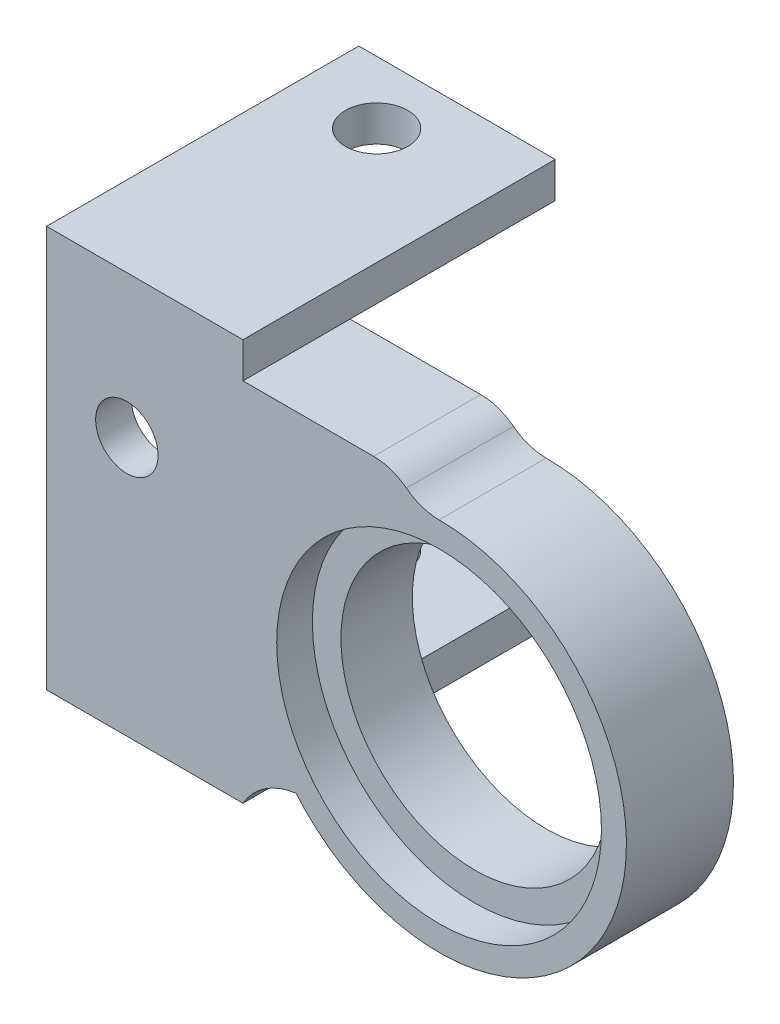
ISO-10303-21;
HEADER;
FILE_DESCRIPTION(('STEP AP214'),'2;1');
FILE_NAME('part.step','',(''),(''),'','','');
FILE_SCHEMA(('AUTOMOTIVE_DESIGN { 1 0 10303 214 1 1 1 1 }'));
ENDSEC;
DATA;
#1=APPLICATION_CONTEXT('core data for automotive mechanical design processes');
#2=APPLICATION_PROTOCOL_DEFINITION('international standard','automotive_design',2000,#1);
#3=PRODUCT_CONTEXT('',#1,'mechanical');
#4=PRODUCT('Part','Part','',(#3));
#5=PRODUCT_RELATED_PRODUCT_CATEGORY('part','',(#4));
#6=PRODUCT_DEFINITION_FORMATION('','',#4);
#7=PRODUCT_DEFINITION_CONTEXT('part definition',#1,'design');
#8=PRODUCT_DEFINITION('design','',#6,#7);
#9=PRODUCT_DEFINITION_SHAPE('','',#8);
#10=(LENGTH_UNIT() NAMED_UNIT(*) SI_UNIT(.MILLI.,.METRE.));
#11=(NAMED_UNIT(*) PLANE_ANGLE_UNIT() SI_UNIT($,.RADIAN.));
#12=(NAMED_UNIT(*) SI_UNIT($,.STERADIAN.) SOLID_ANGLE_UNIT());
#13=UNCERTAINTY_MEASURE_WITH_UNIT(LENGTH_MEASURE(1.E-05),#10,'distance_accuracy_value','');
#14=(GEOMETRIC_REPRESENTATION_CONTEXT(3) GLOBAL_UNCERTAINTY_ASSIGNED_CONTEXT((#13)) GLOBAL_UNIT_ASSIGNED_CONTEXT((#10,
#11,#12)) REPRESENTATION_CONTEXT('',''));
#15=CARTESIAN_POINT('',(0.,0.,0.));
#16=DIRECTION('',(0.,0.,1.));
#17=DIRECTION('',(1.,0.,0.));
#18=AXIS2_PLACEMENT_3D('',#15,#16,#17);
#19=CARTESIAN_POINT('',(0.,0.,-57.));
#20=DIRECTION('',(0.,0.,1.));
#21=DIRECTION('',(1.,0.,0.));
#22=AXIS2_PLACEMENT_3D('',#19,#20,#21);
#23=CYLINDRICAL_SURFACE('',#22,7.5);
#24=CARTESIAN_POINT('',(0.,0.,-57.));
#25=DIRECTION('',(0.,0.,1.));
#26=DIRECTION('',(1.,0.,0.));
#27=AXIS2_PLACEMENT_3D('',#24,#25,#26);
#28=CIRCLE('',#27,7.5);
#29=CARTESIAN_POINT('',(7.5,0.,-57.));
#30=VERTEX_POINT('',#29);
#31=EDGE_CURVE('E144',#30,#30,#28,.T.);
#32=CARTESIAN_POINT('',(0.,0.,-53.));
#33=DIRECTION('',(0.,0.,1.));
#34=DIRECTION('',(1.,0.,0.));
#35=AXIS2_PLACEMENT_3D('',#32,#33,#34);
#36=CIRCLE('',#35,7.5);
#37=CARTESIAN_POINT('',(7.5,0.,-53.));
#38=VERTEX_POINT('',#37);
#39=EDGE_CURVE('E38',#38,#38,#36,.F.);
#40=CARTESIAN_POINT('',(7.5,0.,-57.));
#41=CARTESIAN_POINT('',(7.5,0.,-56.9583333333333));
#42=CARTESIAN_POINT('',(7.5,0.,-56.9166666666667));
#43=CARTESIAN_POINT('',(7.5,0.,-56.8333333333333));
#44=CARTESIAN_POINT('',(7.5,0.,-56.7916666666667));
#45=CARTESIAN_POINT('',(7.5,0.,-56.7083333333333));
#46=CARTESIAN_POINT('',(7.5,0.,-56.6666666666667));
#47=CARTESIAN_POINT('',(7.5,0.,-56.5833333333333));
#48=CARTESIAN_POINT('',(7.5,0.,-56.5416666666667));
#49=CARTESIAN_POINT('',(7.5,0.,-56.4583333333333));
#50=CARTESIAN_POINT('',(7.5,0.,-56.4166666666667));
#51=CARTESIAN_POINT('',(7.5,0.,-56.3333333333333));
#52=CARTESIAN_POINT('',(7.5,0.,-56.2916666666667));
#53=CARTESIAN_POINT('',(7.5,0.,-56.2083333333333));
#54=CARTESIAN_POINT('',(7.5,0.,-56.1666666666667));
#55=CARTESIAN_POINT('',(7.5,0.,-56.0833333333333));
#56=CARTESIAN_POINT('',(7.5,0.,-56.0416666666667));
#57=CARTESIAN_POINT('',(7.5,0.,-55.9583333333333));
#58=CARTESIAN_POINT('',(7.5,0.,-55.9166666666667));
#59=CARTESIAN_POINT('',(7.5,0.,-55.8333333333333));
#60=CARTESIAN_POINT('',(7.5,0.,-55.7916666666667));
#61=CARTESIAN_POINT('',(7.5,0.,-55.7083333333333));
#62=CARTESIAN_POINT('',(7.5,0.,-55.6666666666667));
#63=CARTESIAN_POINT('',(7.5,0.,-55.5833333333333));
#64=CARTESIAN_POINT('',(7.5,0.,-55.5416666666667));
#65=CARTESIAN_POINT('',(7.5,0.,-55.4583333333333));
#66=CARTESIAN_POINT('',(7.5,0.,-55.4166666666667));
#67=CARTESIAN_POINT('',(7.5,0.,-55.3333333333333));
#68=CARTESIAN_POINT('',(7.5,0.,-55.2916666666667));
#69=CARTESIAN_POINT('',(7.5,0.,-55.2083333333333));
#70=CARTESIAN_POINT('',(7.5,0.,-55.1666666666667));
#71=CARTESIAN_POINT('',(7.5,0.,-55.0833333333333));
#72=CARTESIAN_POINT('',(7.5,0.,-55.0416666666667));
#73=CARTESIAN_POINT('',(7.5,0.,-54.9583333333333));
#74=CARTESIAN_POINT('',(7.5,0.,-54.9166666666667));
#75=CARTESIAN_POINT('',(7.5,0.,-54.8333333333333));
#76=CARTESIAN_POINT('',(7.5,0.,-54.7916666666667));
#77=CARTESIAN_POINT('',(7.5,0.,-54.7083333333333));
#78=CARTESIAN_POINT('',(7.5,0.,-54.6666666666667));
#79=CARTESIAN_POINT('',(7.5,0.,-54.5833333333333));
#80=CARTESIAN_POINT('',(7.5,0.,-54.5416666666667));
#81=CARTESIAN_POINT('',(7.5,0.,-54.4583333333333));
#82=CARTESIAN_POINT('',(7.5,0.,-54.4166666666667));
#83=CARTESIAN_POINT('',(7.5,0.,-54.3333333333333));
#84=CARTESIAN_POINT('',(7.5,0.,-54.2916666666667));
#85=CARTESIAN_POINT('',(7.5,0.,-54.2083333333333));
#86=CARTESIAN_POINT('',(7.5,0.,-54.1666666666667));
#87=CARTESIAN_POINT('',(7.5,0.,-54.0833333333333));
#88=CARTESIAN_POINT('',(7.5,0.,-54.0416666666667));
#89=CARTESIAN_POINT('',(7.5,0.,-53.9583333333333));
#90=CARTESIAN_POINT('',(7.5,0.,-53.9166666666667));
#91=CARTESIAN_POINT('',(7.5,0.,-53.8333333333333));
#92=CARTESIAN_POINT('',(7.5,0.,-53.7916666666667));
#93=CARTESIAN_POINT('',(7.5,0.,-53.7083333333333));
#94=CARTESIAN_POINT('',(7.5,0.,-53.6666666666667));
#95=CARTESIAN_POINT('',(7.5,0.,-53.5833333333333));
#96=CARTESIAN_POINT('',(7.5,0.,-53.5416666666667));
#97=CARTESIAN_POINT('',(7.5,0.,-53.4583333333333));
#98=CARTESIAN_POINT('',(7.5,0.,-53.4166666666667));
#99=CARTESIAN_POINT('',(7.5,0.,-53.3333333333333));
#100=CARTESIAN_POINT('',(7.5,0.,-53.2916666666667));
#101=CARTESIAN_POINT('',(7.5,0.,-53.2083333333333));
#102=CARTESIAN_POINT('',(7.5,0.,-53.1666666666667));
#103=CARTESIAN_POINT('',(7.5,0.,-53.0833333333333));
#104=CARTESIAN_POINT('',(7.5,0.,-53.0416666666667));
#105=CARTESIAN_POINT('',(7.5,0.,-53.));
#106=B_SPLINE_CURVE_WITH_KNOTS('',3,(#40,#41,#42,#43,#44,#45,#46,#47,#48,#49,#50,#51,#52,#53,
#54,#55,#56,#57,#58,#59,#60,#61,#62,#63,#64,#65,#66,#67,#68,#69,#70,#71,#72,#73,#74,#75,#76,#77,
#78,#79,#80,#81,#82,#83,#84,#85,#86,#87,#88,#89,#90,#91,#92,#93,#94,#95,#96,#97,#98,#99,#100,
#101,#102,#103,#104,#105),.UNSPECIFIED.,.F.,.F.,(4,2,2,2,2,2,2,2,2,2,2,2,2,2,2,2,2,2,2,2,2,2,2,
2,2,2,2,2,2,2,2,2,4),(0.,0.124999999999993,0.249999999999993,0.374999999999993,
0.499999999999994,0.624999999999994,0.749999999999994,0.874999999999994,0.999999999999994,
1.12499999999999,1.24999999999999,1.37499999999999,1.49999999999999,1.62499999999999,
1.74999999999999,1.87499999999999,1.99999999999999,2.125,2.25,2.375,2.5,2.625,2.75,2.875,3.,
3.125,3.25,3.375,3.5,3.625,3.75,3.87499999999999,3.99999999999999),.UNSPECIFIED.);
#107=EDGE_CURVE('BSEAM35',#30,#38,#106,.T.);
#108=ORIENTED_EDGE('',*,*,#31,.F.);
#109=ORIENTED_EDGE('',*,*,#39,.F.);
#110=ORIENTED_EDGE('',*,*,#107,.T.);
#111=ORIENTED_EDGE('',*,*,#107,.F.);
#112=EDGE_LOOP('',(#108,#110,#109,#111));
#113=FACE_BOUND('',#112,.T.);
#114=ADVANCED_FACE('F35',(#113),#23,.F.);
#115=CARTESIAN_POINT('',(-1.8328597873269,11.125,-51.));
#116=DIRECTION('',(0.,0.,1.));
#117=DIRECTION('',(1.,0.,0.));
#118=AXIS2_PLACEMENT_3D('',#115,#116,#117);
#119=PLANE('',#118);
#120=CARTESIAN_POINT('',(0.,0.,-51.));
#121=DIRECTION('',(0.,0.,1.));
#122=DIRECTION('',(1.,0.,0.));
#123=AXIS2_PLACEMENT_3D('',#120,#121,#122);
#124=CIRCLE('',#123,9.1);
#125=CARTESIAN_POINT('',(9.1,0.,-51.));
#126=VERTEX_POINT('',#125);
#127=EDGE_CURVE('E127',#126,#126,#124,.T.);
#128=ORIENTED_EDGE('',*,*,#127,.F.);
#129=EDGE_LOOP('',(#128));
#130=FACE_BOUND('',#129,.T.);
#131=CARTESIAN_POINT('',(0.,0.,-51.));
#132=DIRECTION('',(0.,0.,1.));
#133=DIRECTION('',(1.,0.,0.));
#134=AXIS2_PLACEMENT_3D('',#131,#132,#133);
#135=CIRCLE('',#134,10.5);
#136=CARTESIAN_POINT('',(0.,10.5,-51.));
#137=VERTEX_POINT('',#136);
#138=CARTESIAN_POINT('',(-8.01732503696485,-6.78030229795591,-51.));
#139=VERTEX_POINT('',#138);
#140=EDGE_CURVE('E111',#137,#139,#135,.F.);
#141=ORIENTED_EDGE('',*,*,#140,.F.);
#142=CARTESIAN_POINT('',(0.,13.5,-51.));
#143=DIRECTION('',(0.,0.,1.));
#144=DIRECTION('',(-1.,0.,0.));
#145=AXIS2_PLACEMENT_3D('',#142,#143,#144);
#146=CIRCLE('',#145,3.);
#147=CARTESIAN_POINT('',(-1.8328597873269,11.125,-51.));
#148=VERTEX_POINT('',#147);
#149=EDGE_CURVE('E161',#148,#137,#146,.T.);
#150=ORIENTED_EDGE('',*,*,#149,.F.);
#151=CARTESIAN_POINT('',(-3.6657195746538,8.75,-51.));
#152=DIRECTION('',(0.,0.,-1.));
#153=DIRECTION('',(-1.,0.,0.));
#154=AXIS2_PLACEMENT_3D('',#151,#152,#153);
#155=CIRCLE('',#154,3.);
#156=CARTESIAN_POINT('',(-3.6657195746538,11.75,-51.));
#157=VERTEX_POINT('',#156);
#158=EDGE_CURVE('E151',#157,#148,#155,.T.);
#159=ORIENTED_EDGE('',*,*,#158,.F.);
#160=DIRECTION('',(1.,0.,0.));
#161=VECTOR('',#160,1.);
#162=CARTESIAN_POINT('',(-3.6657195746538,11.75,-51.));
#163=LINE('',#162,#161);
#164=CARTESIAN_POINT('',(-10.99,11.75,-51.));
#165=VERTEX_POINT('',#164);
#166=EDGE_CURVE('E170',#165,#157,#163,.T.);
#167=ORIENTED_EDGE('',*,*,#166,.F.);
#168=DIRECTION('',(0.,-1.,0.));
#169=VECTOR('',#168,1.);
#170=CARTESIAN_POINT('',(-10.99,13.75,-51.));
#171=LINE('',#170,#169);
#172=CARTESIAN_POINT('',(-10.99,13.75,-51.));
#173=VERTEX_POINT('',#172);
#174=EDGE_CURVE('E202',#173,#165,#171,.T.);
#175=ORIENTED_EDGE('',*,*,#174,.F.);
#176=DIRECTION('',(1.,0.,0.));
#177=VECTOR('',#176,1.);
#178=CARTESIAN_POINT('',(-22.,13.75,-51.));
#179=LINE('',#178,#177);
#180=CARTESIAN_POINT('',(-22.,13.75,-51.));
#181=VERTEX_POINT('',#180);
#182=EDGE_CURVE('E231',#181,#173,#179,.T.);
#183=ORIENTED_EDGE('',*,*,#182,.F.);
#184=DIRECTION('',(0.,1.,0.));
#185=VECTOR('',#184,1.);
#186=CARTESIAN_POINT('',(-22.,11.75,-51.));
#187=LINE('',#186,#185);
#188=CARTESIAN_POINT('',(-22.,-8.75,-51.));
#189=VERTEX_POINT('',#188);
#190=EDGE_CURVE('E173',#189,#181,#187,.T.);
#191=ORIENTED_EDGE('',*,*,#190,.F.);
#192=DIRECTION('',(-1.,0.,0.));
#193=VECTOR('',#192,1.);
#194=CARTESIAN_POINT('',(-22.,-8.75,-51.));
#195=LINE('',#194,#193);
#196=CARTESIAN_POINT('',(-10.99,-8.75,-51.));
#197=VERTEX_POINT('',#196);
#198=EDGE_CURVE('E89',#197,#189,#195,.T.);
#199=ORIENTED_EDGE('',*,*,#198,.F.);
#200=CARTESIAN_POINT('',(-7.52589838486225,-10.75,-51.));
#201=DIRECTION('',(0.,0.,-1.));
#202=DIRECTION('',(-1.,0.,0.));
#203=AXIS2_PLACEMENT_3D('',#200,#201,#202);
#204=CIRCLE('',#203,4.);
#205=EDGE_CURVE('E120',#197,#139,#204,.T.);
#206=ORIENTED_EDGE('',*,*,#205,.T.);
#207=EDGE_LOOP('',(#141,#150,#159,#167,#175,#183,#191,#199,#206));
#208=FACE_BOUND('',#207,.T.);
#209=CARTESIAN_POINT('',(-17.5,5.75,-51.));
#210=DIRECTION('',(0.,0.,-1.));
#211=DIRECTION('',(-1.,0.,0.));
#212=AXIS2_PLACEMENT_3D('',#209,#210,#211);
#213=CIRCLE('',#212,1.75);
#214=CARTESIAN_POINT('',(-19.25,5.75,-51.));
#215=VERTEX_POINT('',#214);
#216=EDGE_CURVE('E167',#215,#215,#213,.T.);
#217=ORIENTED_EDGE('',*,*,#216,.T.);
#218=EDGE_LOOP('',(#217));
#219=FACE_BOUND('',#218,.T.);
#220=ADVANCED_FACE('F262',(#130,#208,#219),#119,.T.);
#221=CARTESIAN_POINT('',(-11.,-6.75,-31.4767567499691));
#222=DIRECTION('',(-1.,0.,0.));
#223=DIRECTION('',(0.,-1.,0.));
#224=AXIS2_PLACEMENT_3D('',#221,#222,#223);
#225=PLANE('',#224);
#226=DIRECTION('',(0.,-1.,0.));
#227=VECTOR('',#226,1.);
#228=CARTESIAN_POINT('',(-11.,-6.75,-53.));
#229=LINE('',#228,#227);
#230=CARTESIAN_POINT('',(-11.,11.75,-53.));
#231=VERTEX_POINT('',#230);
#232=CARTESIAN_POINT('',(-11.,-6.75,-53.));
#233=VERTEX_POINT('',#232);
#234=EDGE_CURVE('E180',#231,#233,#229,.T.);
#235=ORIENTED_EDGE('',*,*,#234,.F.);
#236=DIRECTION('',(0.,0.,-1.));
#237=VECTOR('',#236,1.);
#238=CARTESIAN_POINT('',(-11.,11.75,-31.4767567499691));
#239=LINE('',#238,#237);
#240=CARTESIAN_POINT('',(-11.,11.75,-57.));
#241=VERTEX_POINT('',#240);
#242=EDGE_CURVE('E187',#231,#241,#239,.T.);
#243=ORIENTED_EDGE('',*,*,#242,.T.);
#244=DIRECTION('',(0.,1.,0.));
#245=VECTOR('',#244,1.);
#246=CARTESIAN_POINT('',(-11.,-6.75,-57.));
#247=LINE('',#246,#245);
#248=CARTESIAN_POINT('',(-11.,-6.75,-57.));
#249=VERTEX_POINT('',#248);
#250=EDGE_CURVE('E196',#249,#241,#247,.T.);
#251=ORIENTED_EDGE('',*,*,#250,.F.);
#252=DIRECTION('',(0.,0.,-1.));
#253=VECTOR('',#252,1.);
#254=CARTESIAN_POINT('',(-11.,-6.75,-31.4767567499691));
#255=LINE('',#254,#253);
#256=EDGE_CURVE('E183',#233,#249,#255,.T.);
#257=ORIENTED_EDGE('',*,*,#256,.F.);
#258=EDGE_LOOP('',(#235,#243,#251,#257));
#259=FACE_BOUND('',#258,.T.);
#260=ADVANCED_FACE('F264',(#259),#225,.T.);
#261=CARTESIAN_POINT('',(0.,13.5,-51.));
#262=DIRECTION('',(0.,0.,-1.));
#263=DIRECTION('',(-1.,0.,0.));
#264=AXIS2_PLACEMENT_3D('',#261,#262,#263);
#265=CYLINDRICAL_SURFACE('',#264,3.);
#266=DIRECTION('',(0.,0.,-1.));
#267=VECTOR('',#266,1.);
#268=CARTESIAN_POINT('',(0.,10.5,-51.));
#269=LINE('',#268,#267);
#270=CARTESIAN_POINT('',(0.,10.5,-57.));
#271=VERTEX_POINT('',#270);
#272=EDGE_CURVE('E148',#137,#271,#269,.T.);
#273=ORIENTED_EDGE('',*,*,#272,.T.);
#274=CARTESIAN_POINT('',(0.,13.5,-57.));
#275=DIRECTION('',(0.,0.,1.));
#276=DIRECTION('',(1.,0.,0.));
#277=AXIS2_PLACEMENT_3D('',#274,#275,#276);
#278=CIRCLE('',#277,3.);
#279=CARTESIAN_POINT('',(-1.8328597873269,11.125,-57.));
#280=VERTEX_POINT('',#279);
#281=EDGE_CURVE('E199',#280,#271,#278,.T.);
#282=ORIENTED_EDGE('',*,*,#281,.F.);
#283=DIRECTION('',(0.,0.,-1.));
#284=VECTOR('',#283,1.);
#285=CARTESIAN_POINT('',(-1.8328597873269,11.125,-51.));
#286=LINE('',#285,#284);
#287=EDGE_CURVE('E147',#148,#280,#286,.T.);
#288=ORIENTED_EDGE('',*,*,#287,.F.);
#289=ORIENTED_EDGE('',*,*,#149,.T.);
#290=EDGE_LOOP('',(#273,#282,#288,#289));
#291=FACE_BOUND('',#290,.T.);
#292=ADVANCED_FACE('F275',(#291),#265,.F.);
#293=CARTESIAN_POINT('',(-3.6657195746538,8.75,-51.));
#294=DIRECTION('',(0.,0.,-1.));
#295=DIRECTION('',(-1.,0.,0.));
#296=AXIS2_PLACEMENT_3D('',#293,#294,#295);
#297=CYLINDRICAL_SURFACE('',#296,3.);
#298=ORIENTED_EDGE('',*,*,#287,.T.);
#299=CARTESIAN_POINT('',(-3.66571957465382,8.74999999999994,-57.));
#300=DIRECTION('',(0.,0.,-1.));
#301=DIRECTION('',(1.,0.,0.));
#302=AXIS2_PLACEMENT_3D('',#299,#300,#301);
#303=CIRCLE('',#302,3.00000000000006);
#304=CARTESIAN_POINT('',(-3.6657195746538,11.75,-57.));
#305=VERTEX_POINT('',#304);
#306=EDGE_CURVE('E186',#305,#280,#303,.T.);
#307=ORIENTED_EDGE('',*,*,#306,.F.);
#308=DIRECTION('',(0.,0.,-1.));
#309=VECTOR('',#308,1.);
#310=CARTESIAN_POINT('',(-3.6657195746538,11.75,-51.));
#311=LINE('',#310,#309);
#312=EDGE_CURVE('E152',#157,#305,#311,.T.);
#313=ORIENTED_EDGE('',*,*,#312,.F.);
#314=ORIENTED_EDGE('',*,*,#158,.T.);
#315=EDGE_LOOP('',(#298,#307,#313,#314));
#316=FACE_BOUND('',#315,.T.);
#317=ADVANCED_FACE('F281',(#316),#297,.T.);
#318=CARTESIAN_POINT('',(0.,-6.75,0.));
#319=DIRECTION('',(0.,-1.,0.));
#320=DIRECTION('',(0.,0.,-1.));
#321=AXIS2_PLACEMENT_3D('',#318,#319,#320);
#322=PLANE('',#321);
#323=CARTESIAN_POINT('',(-17.5,-6.75,-65.));
#324=DIRECTION('',(0.,-1.,0.));
#325=DIRECTION('',(0.,0.,-1.));
#326=AXIS2_PLACEMENT_3D('',#323,#324,#325);
#327=CIRCLE('',#326,1.75);
#328=CARTESIAN_POINT('',(-17.5,-6.75,-66.75));
#329=VERTEX_POINT('',#328);
#330=EDGE_CURVE('E11',#329,#329,#327,.T.);
#331=ORIENTED_EDGE('',*,*,#330,.T.);
#332=EDGE_LOOP('',(#331));
#333=FACE_BOUND('',#332,.T.);
#334=ORIENTED_EDGE('',*,*,#256,.T.);
#335=DIRECTION('',(1.,0.,0.));
#336=VECTOR('',#335,1.);
#337=CARTESIAN_POINT('',(0.,-6.75,-57.));
#338=LINE('',#337,#336);
#339=CARTESIAN_POINT('',(-10.99,-6.75,-57.));
#340=VERTEX_POINT('',#339);
#341=EDGE_CURVE('E94',#249,#340,#338,.T.);
#342=ORIENTED_EDGE('',*,*,#341,.T.);
#343=DIRECTION('',(0.,0.,1.));
#344=VECTOR('',#343,1.);
#345=CARTESIAN_POINT('',(-10.99,-6.75,-51.));
#346=LINE('',#345,#344);
#347=CARTESIAN_POINT('',(-10.99,-6.75,-68.5));
#348=VERTEX_POINT('',#347);
#349=EDGE_CURVE('E91',#348,#340,#346,.T.);
#350=ORIENTED_EDGE('',*,*,#349,.F.);
#351=DIRECTION('',(1.,0.,0.));
#352=VECTOR('',#351,1.);
#353=CARTESIAN_POINT('',(-22.,-6.75,-68.5));
#354=LINE('',#353,#352);
#355=CARTESIAN_POINT('',(-22.,-6.75,-68.5));
#356=VERTEX_POINT('',#355);
#357=EDGE_CURVE('E104',#356,#348,#354,.T.);
#358=ORIENTED_EDGE('',*,*,#357,.F.);
#359=DIRECTION('',(0.,0.,-1.));
#360=VECTOR('',#359,1.);
#361=CARTESIAN_POINT('',(-22.,-6.75,-51.));
#362=LINE('',#361,#360);
#363=CARTESIAN_POINT('',(-22.,-6.75,-53.));
#364=VERTEX_POINT('',#363);
#365=EDGE_CURVE('E53',#364,#356,#362,.T.);
#366=ORIENTED_EDGE('',*,*,#365,.F.);
#367=DIRECTION('',(-1.,0.,0.));
#368=VECTOR('',#367,1.);
#369=CARTESIAN_POINT('',(-8.04285397107271,-6.75,-53.));
#370=LINE('',#369,#368);
#371=EDGE_CURVE('E164',#233,#364,#370,.T.);
#372=ORIENTED_EDGE('',*,*,#371,.F.);
#373=EDGE_LOOP('',(#334,#342,#350,#358,#366,#372));
#374=FACE_BOUND('',#373,.T.);
#375=ADVANCED_FACE('F324',(#333,#374),#322,.F.);
#376=CARTESIAN_POINT('',(0.,13.5,-53.));
#377=DIRECTION('',(0.,0.,-1.));
#378=DIRECTION('',(-1.,0.,0.));
#379=AXIS2_PLACEMENT_3D('',#376,#377,#378);
#380=PLANE('',#379);
#381=ORIENTED_EDGE('',*,*,#234,.T.);
#382=ORIENTED_EDGE('',*,*,#371,.T.);
#383=DIRECTION('',(0.,1.,0.));
#384=VECTOR('',#383,1.);
#385=CARTESIAN_POINT('',(-22.,11.75,-53.));
#386=LINE('',#385,#384);
#387=CARTESIAN_POINT('',(-22.,11.75,-53.));
#388=VERTEX_POINT('',#387);
#389=EDGE_CURVE('E160',#364,#388,#386,.T.);
#390=ORIENTED_EDGE('',*,*,#389,.T.);
#391=DIRECTION('',(1.,0.,0.));
#392=VECTOR('',#391,1.);
#393=CARTESIAN_POINT('',(-3.6657195746538,11.75,-53.));
#394=LINE('',#393,#392);
#395=EDGE_CURVE('E157',#388,#231,#394,.T.);
#396=ORIENTED_EDGE('',*,*,#395,.T.);
#397=EDGE_LOOP('',(#381,#382,#390,#396));
#398=FACE_BOUND('',#397,.T.);
#399=CARTESIAN_POINT('',(-17.5,5.75,-53.));
#400=DIRECTION('',(0.,0.,-1.));
#401=DIRECTION('',(-1.,0.,0.));
#402=AXIS2_PLACEMENT_3D('',#399,#400,#401);
#403=CIRCLE('',#402,1.75);
#404=CARTESIAN_POINT('',(-19.25,5.75,-53.));
#405=VERTEX_POINT('',#404);
#406=EDGE_CURVE('E177',#405,#405,#403,.T.);
#407=ORIENTED_EDGE('',*,*,#406,.F.);
#408=EDGE_LOOP('',(#407));
#409=FACE_BOUND('',#408,.T.);
#410=ADVANCED_FACE('F364',(#398,#409),#380,.T.);
#411=CARTESIAN_POINT('',(-17.5,5.75,-51.));
#412=DIRECTION('',(0.,0.,-1.));
#413=DIRECTION('',(-1.,0.,0.));
#414=AXIS2_PLACEMENT_3D('',#411,#412,#413);
#415=CYLINDRICAL_SURFACE('',#414,1.75);
#416=ORIENTED_EDGE('',*,*,#216,.F.);
#417=EDGE_LOOP('',(#416));
#418=FACE_BOUND('',#417,.T.);
#419=ORIENTED_EDGE('',*,*,#406,.T.);
#420=EDGE_LOOP('',(#419));
#421=FACE_BOUND('',#420,.T.);
#422=ADVANCED_FACE('F287',(#418,#421),#415,.F.);
#423=CARTESIAN_POINT('',(-17.5,13.75,-65.));
#424=DIRECTION('',(0.,-1.,0.));
#425=DIRECTION('',(1.,0.,0.));
#426=AXIS2_PLACEMENT_3D('',#423,#424,#425);
#427=CYLINDRICAL_SURFACE('',#426,1.75);
#428=CARTESIAN_POINT('',(-17.5,13.75,-65.));
#429=DIRECTION('',(0.,1.,0.));
#430=DIRECTION('',(-1.,0.,0.));
#431=AXIS2_PLACEMENT_3D('',#428,#429,#430);
#432=CIRCLE('',#431,1.75);
#433=CARTESIAN_POINT('',(-19.25,13.75,-65.));
#434=VERTEX_POINT('',#433);
#435=EDGE_CURVE('E225',#434,#434,#432,.T.);
#436=ORIENTED_EDGE('',*,*,#435,.T.);
#437=EDGE_LOOP('',(#436));
#438=FACE_BOUND('',#437,.T.);
#439=CARTESIAN_POINT('',(-17.5,11.75,-65.));
#440=DIRECTION('',(0.,1.,0.));
#441=DIRECTION('',(-1.,0.,0.));
#442=AXIS2_PLACEMENT_3D('',#439,#440,#441);
#443=CIRCLE('',#442,1.75);
#444=CARTESIAN_POINT('',(-19.25,11.75,-65.));
#445=VERTEX_POINT('',#444);
#446=EDGE_CURVE('E98',#445,#445,#443,.T.);
#447=ORIENTED_EDGE('',*,*,#446,.F.);
#448=EDGE_LOOP('',(#447));
#449=FACE_BOUND('',#448,.T.);
#450=ADVANCED_FACE('F240',(#438,#449),#427,.F.);
#451=CARTESIAN_POINT('',(-17.5,-8.75,-65.));
#452=DIRECTION('',(0.,1.,0.));
#453=DIRECTION('',(0.,0.,1.));
#454=AXIS2_PLACEMENT_3D('',#451,#452,#453);
#455=CYLINDRICAL_SURFACE('',#454,1.75);
#456=CARTESIAN_POINT('',(-17.5,-8.75,-65.));
#457=DIRECTION('',(0.,-1.,0.));
#458=DIRECTION('',(0.,0.,-1.));
#459=AXIS2_PLACEMENT_3D('',#456,#457,#458);
#460=CIRCLE('',#459,1.75);
#461=CARTESIAN_POINT('',(-17.5,-8.75,-66.75));
#462=VERTEX_POINT('',#461);
#463=EDGE_CURVE('E44',#462,#462,#460,.T.);
#464=ORIENTED_EDGE('',*,*,#463,.T.);
#465=EDGE_LOOP('',(#464));
#466=FACE_BOUND('',#465,.T.);
#467=ORIENTED_EDGE('',*,*,#330,.F.);
#468=EDGE_LOOP('',(#467));
#469=FACE_BOUND('',#468,.T.);
#470=ADVANCED_FACE('F401',(#466,#469),#455,.F.);
#471=CARTESIAN_POINT('',(-10.99,-8.75,-51.));
#472=DIRECTION('',(-1.,0.,0.));
#473=DIRECTION('',(0.,0.,1.));
#474=AXIS2_PLACEMENT_3D('',#471,#472,#473);
#475=PLANE('',#474);
#476=ORIENTED_EDGE('',*,*,#349,.T.);
#477=DIRECTION('',(0.,-1.,0.));
#478=VECTOR('',#477,1.);
#479=CARTESIAN_POINT('',(-10.99,0.,-57.));
#480=LINE('',#479,#478);
#481=CARTESIAN_POINT('',(-10.99,-8.75,-57.));
#482=VERTEX_POINT('',#481);
#483=EDGE_CURVE('E138',#340,#482,#480,.T.);
#484=ORIENTED_EDGE('',*,*,#483,.T.);
#485=DIRECTION('',(0.,0.,1.));
#486=VECTOR('',#485,1.);
#487=CARTESIAN_POINT('',(-10.99,-8.75,-51.));
#488=LINE('',#487,#486);
#489=CARTESIAN_POINT('',(-10.99,-8.75,-68.5));
#490=VERTEX_POINT('',#489);
#491=EDGE_CURVE('E108',#490,#482,#488,.T.);
#492=ORIENTED_EDGE('',*,*,#491,.F.);
#493=DIRECTION('',(0.,1.,0.));
#494=VECTOR('',#493,1.);
#495=CARTESIAN_POINT('',(-10.99,-8.75,-68.5));
#496=LINE('',#495,#494);
#497=EDGE_CURVE('E78',#490,#348,#496,.T.);
#498=ORIENTED_EDGE('',*,*,#497,.T.);
#499=EDGE_LOOP('',(#476,#484,#492,#498));
#500=FACE_BOUND('',#499,.T.);
#501=ADVANCED_FACE('F367',(#500),#475,.F.);
#502=CARTESIAN_POINT('',(-22.,-8.75,-68.5));
#503=DIRECTION('',(0.,0.,1.));
#504=DIRECTION('',(1.,0.,0.));
#505=AXIS2_PLACEMENT_3D('',#502,#503,#504);
#506=PLANE('',#505);
#507=ORIENTED_EDGE('',*,*,#357,.T.);
#508=ORIENTED_EDGE('',*,*,#497,.F.);
#509=DIRECTION('',(1.,0.,0.));
#510=VECTOR('',#509,1.);
#511=CARTESIAN_POINT('',(-22.,-8.75,-68.5));
#512=LINE('',#511,#510);
#513=CARTESIAN_POINT('',(-22.,-8.75,-68.5));
#514=VERTEX_POINT('',#513);
#515=EDGE_CURVE('E71',#514,#490,#512,.T.);
#516=ORIENTED_EDGE('',*,*,#515,.F.);
#517=DIRECTION('',(0.,1.,0.));
#518=VECTOR('',#517,1.);
#519=CARTESIAN_POINT('',(-22.,-8.75,-68.5));
#520=LINE('',#519,#518);
#521=EDGE_CURVE('E76',#514,#356,#520,.T.);
#522=ORIENTED_EDGE('',*,*,#521,.T.);
#523=EDGE_LOOP('',(#507,#508,#516,#522));
#524=FACE_BOUND('',#523,.T.);
#525=ADVANCED_FACE('F75',(#524),#506,.F.);
#526=CARTESIAN_POINT('',(-22.,11.75,-51.));
#527=DIRECTION('',(-1.,0.,0.));
#528=DIRECTION('',(0.,-1.,0.));
#529=AXIS2_PLACEMENT_3D('',#526,#527,#528);
#530=PLANE('',#529);
#531=ORIENTED_EDGE('',*,*,#389,.F.);
#532=ORIENTED_EDGE('',*,*,#365,.T.);
#533=ORIENTED_EDGE('',*,*,#521,.F.);
#534=DIRECTION('',(0.,0.,-1.));
#535=VECTOR('',#534,1.);
#536=CARTESIAN_POINT('',(-22.,-8.75,-51.));
#537=LINE('',#536,#535);
#538=EDGE_CURVE('E80',#189,#514,#537,.T.);
#539=ORIENTED_EDGE('',*,*,#538,.F.);
#540=ORIENTED_EDGE('',*,*,#190,.T.);
#541=DIRECTION('',(0.,0.,1.));
#542=VECTOR('',#541,1.);
#543=CARTESIAN_POINT('',(-22.,13.75,-51.));
#544=LINE('',#543,#542);
#545=CARTESIAN_POINT('',(-22.,13.75,-68.5));
#546=VERTEX_POINT('',#545);
#547=EDGE_CURVE('E218',#546,#181,#544,.T.);
#548=ORIENTED_EDGE('',*,*,#547,.F.);
#549=DIRECTION('',(0.,-1.,0.));
#550=VECTOR('',#549,1.);
#551=CARTESIAN_POINT('',(-22.,13.75,-68.5));
#552=LINE('',#551,#550);
#553=CARTESIAN_POINT('',(-22.,11.75,-68.5));
#554=VERTEX_POINT('',#553);
#555=EDGE_CURVE('E210',#546,#554,#552,.T.);
#556=ORIENTED_EDGE('',*,*,#555,.T.);
#557=DIRECTION('',(0.,0.,1.));
#558=VECTOR('',#557,1.);
#559=CARTESIAN_POINT('',(-22.,11.75,-51.));
#560=LINE('',#559,#558);
#561=EDGE_CURVE('E222',#554,#388,#560,.T.);
#562=ORIENTED_EDGE('',*,*,#561,.T.);
#563=EDGE_LOOP('',(#531,#532,#533,#539,#540,#548,#556,#562));
#564=FACE_BOUND('',#563,.T.);
#565=ADVANCED_FACE('F93',(#564),#530,.T.);
#566=CARTESIAN_POINT('',(0.,-8.75,0.));
#567=DIRECTION('',(0.,-1.,0.));
#568=DIRECTION('',(0.,0.,-1.));
#569=AXIS2_PLACEMENT_3D('',#566,#567,#568);
#570=PLANE('',#569);
#571=ORIENTED_EDGE('',*,*,#538,.T.);
#572=ORIENTED_EDGE('',*,*,#515,.T.);
#573=ORIENTED_EDGE('',*,*,#491,.T.);
#574=EDGE_CURVE('E81',#482,#197,#488,.T.);
#575=ORIENTED_EDGE('',*,*,#574,.T.);
#576=ORIENTED_EDGE('',*,*,#198,.T.);
#577=EDGE_LOOP('',(#571,#572,#573,#575,#576));
#578=FACE_BOUND('',#577,.T.);
#579=ORIENTED_EDGE('',*,*,#463,.F.);
#580=EDGE_LOOP('',(#579));
#581=FACE_BOUND('',#580,.T.);
#582=ADVANCED_FACE('F85',(#578,#581),#570,.T.);
#583=CARTESIAN_POINT('',(0.,0.,-57.));
#584=DIRECTION('',(0.,0.,1.));
#585=DIRECTION('',(1.,0.,0.));
#586=AXIS2_PLACEMENT_3D('',#583,#584,#585);
#587=CYLINDRICAL_SURFACE('',#586,10.5);
#588=ORIENTED_EDGE('',*,*,#272,.F.);
#589=ORIENTED_EDGE('',*,*,#140,.T.);
#590=DIRECTION('',(0.,0.,1.));
#591=VECTOR('',#590,1.);
#592=CARTESIAN_POINT('',(-8.01732503696325,-6.78030229795709,-54.));
#593=LINE('',#592,#591);
#594=CARTESIAN_POINT('',(-8.01732503696388,-6.78030229795635,-57.));
#595=VERTEX_POINT('',#594);
#596=EDGE_CURVE('E136',#139,#595,#593,.F.);
#597=ORIENTED_EDGE('',*,*,#596,.T.);
#598=CARTESIAN_POINT('',(0.,0.,-57.));
#599=DIRECTION('',(0.,0.,1.));
#600=DIRECTION('',(1.,0.,0.));
#601=AXIS2_PLACEMENT_3D('',#598,#599,#600);
#602=CIRCLE('',#601,10.5);
#603=EDGE_CURVE('E141',#595,#271,#602,.T.);
#604=ORIENTED_EDGE('',*,*,#603,.T.);
#605=EDGE_LOOP('',(#588,#589,#597,#604));
#606=FACE_BOUND('',#605,.T.);
#607=ADVANCED_FACE('F391',(#606),#587,.T.);
#608=CARTESIAN_POINT('',(0.,0.,-57.));
#609=DIRECTION('',(0.,0.,1.));
#610=DIRECTION('',(1.,0.,0.));
#611=AXIS2_PLACEMENT_3D('',#608,#609,#610);
#612=PLANE('',#611);
#613=ORIENTED_EDGE('',*,*,#31,.T.);
#614=EDGE_LOOP('',(#613));
#615=FACE_BOUND('',#614,.T.);
#616=ORIENTED_EDGE('',*,*,#603,.F.);
#617=CARTESIAN_POINT('',(-7.52589838486225,-10.75,-57.));
#618=DIRECTION('',(0.,0.,1.));
#619=DIRECTION('',(1.,0.,0.));
#620=AXIS2_PLACEMENT_3D('',#617,#618,#619);
#621=CIRCLE('',#620,4.);
#622=EDGE_CURVE('E113',#595,#482,#621,.T.);
#623=ORIENTED_EDGE('',*,*,#622,.T.);
#624=ORIENTED_EDGE('',*,*,#483,.F.);
#625=ORIENTED_EDGE('',*,*,#341,.F.);
#626=ORIENTED_EDGE('',*,*,#250,.T.);
#627=DIRECTION('',(1.,0.,0.));
#628=VECTOR('',#627,1.);
#629=CARTESIAN_POINT('',(-11.,11.75,-57.));
#630=LINE('',#629,#628);
#631=CARTESIAN_POINT('',(-10.99,11.75,-57.));
#632=VERTEX_POINT('',#631);
#633=EDGE_CURVE('E192',#241,#632,#630,.T.);
#634=ORIENTED_EDGE('',*,*,#633,.T.);
#635=EDGE_CURVE('E195',#632,#305,#630,.T.);
#636=ORIENTED_EDGE('',*,*,#635,.T.);
#637=ORIENTED_EDGE('',*,*,#306,.T.);
#638=ORIENTED_EDGE('',*,*,#281,.T.);
#639=EDGE_LOOP('',(#616,#623,#624,#625,#626,#634,#636,#637,#638));
#640=FACE_BOUND('',#639,.T.);
#641=ADVANCED_FACE('F256',(#615,#640),#612,.F.);
#642=CARTESIAN_POINT('',(-7.52589838486225,-10.75,-51.));
#643=DIRECTION('',(0.,0.,1.));
#644=DIRECTION('',(1.,0.,0.));
#645=AXIS2_PLACEMENT_3D('',#642,#643,#644);
#646=CYLINDRICAL_SURFACE('',#645,4.);
#647=ORIENTED_EDGE('',*,*,#622,.F.);
#648=ORIENTED_EDGE('',*,*,#596,.F.);
#649=ORIENTED_EDGE('',*,*,#205,.F.);
#650=ORIENTED_EDGE('',*,*,#574,.F.);
#651=EDGE_LOOP('',(#647,#648,#649,#650));
#652=FACE_BOUND('',#651,.T.);
#653=ADVANCED_FACE('F246',(#652),#646,.F.);
#654=CARTESIAN_POINT('',(0.,13.75,0.));
#655=DIRECTION('',(0.,-1.,0.));
#656=DIRECTION('',(0.,0.,-1.));
#657=AXIS2_PLACEMENT_3D('',#654,#655,#656);
#658=PLANE('',#657);
#659=ORIENTED_EDGE('',*,*,#547,.T.);
#660=ORIENTED_EDGE('',*,*,#182,.T.);
#661=DIRECTION('',(0.,0.,-1.));
#662=VECTOR('',#661,1.);
#663=CARTESIAN_POINT('',(-10.99,13.75,-51.));
#664=LINE('',#663,#662);
#665=CARTESIAN_POINT('',(-10.99,13.75,-68.5));
#666=VERTEX_POINT('',#665);
#667=EDGE_CURVE('E228',#173,#666,#664,.T.);
#668=ORIENTED_EDGE('',*,*,#667,.T.);
#669=DIRECTION('',(-1.,0.,0.));
#670=VECTOR('',#669,1.);
#671=CARTESIAN_POINT('',(-22.,13.75,-68.5));
#672=LINE('',#671,#670);
#673=EDGE_CURVE('E213',#666,#546,#672,.T.);
#674=ORIENTED_EDGE('',*,*,#673,.T.);
#675=EDGE_LOOP('',(#659,#660,#668,#674));
#676=FACE_BOUND('',#675,.T.);
#677=ORIENTED_EDGE('',*,*,#435,.F.);
#678=EDGE_LOOP('',(#677));
#679=FACE_BOUND('',#678,.T.);
#680=ADVANCED_FACE('F243',(#676,#679),#658,.F.);
#681=CARTESIAN_POINT('',(-22.,13.75,-68.5));
#682=DIRECTION('',(0.,0.,1.));
#683=DIRECTION('',(1.,0.,0.));
#684=AXIS2_PLACEMENT_3D('',#681,#682,#683);
#685=PLANE('',#684);
#686=DIRECTION('',(-1.,0.,0.));
#687=VECTOR('',#686,1.);
#688=CARTESIAN_POINT('',(-22.,11.75,-68.5));
#689=LINE('',#688,#687);
#690=CARTESIAN_POINT('',(-10.99,11.75,-68.5));
#691=VERTEX_POINT('',#690);
#692=EDGE_CURVE('E214',#691,#554,#689,.T.);
#693=ORIENTED_EDGE('',*,*,#692,.T.);
#694=ORIENTED_EDGE('',*,*,#555,.F.);
#695=ORIENTED_EDGE('',*,*,#673,.F.);
#696=DIRECTION('',(0.,-1.,0.));
#697=VECTOR('',#696,1.);
#698=CARTESIAN_POINT('',(-10.99,13.75,-68.5));
#699=LINE('',#698,#697);
#700=EDGE_CURVE('E207',#666,#691,#699,.T.);
#701=ORIENTED_EDGE('',*,*,#700,.T.);
#702=EDGE_LOOP('',(#693,#694,#695,#701));
#703=FACE_BOUND('',#702,.T.);
#704=ADVANCED_FACE('F245',(#703),#685,.F.);
#705=CARTESIAN_POINT('',(0.,11.75,0.));
#706=DIRECTION('',(0.,-1.,0.));
#707=DIRECTION('',(0.,0.,-1.));
#708=AXIS2_PLACEMENT_3D('',#705,#706,#707);
#709=PLANE('',#708);
#710=ORIENTED_EDGE('',*,*,#446,.T.);
#711=EDGE_LOOP('',(#710));
#712=FACE_BOUND('',#711,.T.);
#713=ORIENTED_EDGE('',*,*,#633,.F.);
#714=ORIENTED_EDGE('',*,*,#242,.F.);
#715=ORIENTED_EDGE('',*,*,#395,.F.);
#716=ORIENTED_EDGE('',*,*,#561,.F.);
#717=ORIENTED_EDGE('',*,*,#692,.F.);
#718=DIRECTION('',(0.,0.,-1.));
#719=VECTOR('',#718,1.);
#720=CARTESIAN_POINT('',(-10.99,11.75,-51.));
#721=LINE('',#720,#719);
#722=EDGE_CURVE('E221',#632,#691,#721,.T.);
#723=ORIENTED_EDGE('',*,*,#722,.F.);
#724=EDGE_LOOP('',(#713,#714,#715,#716,#717,#723));
#725=FACE_BOUND('',#724,.T.);
#726=ADVANCED_FACE('F253',(#712,#725),#709,.T.);
#727=CARTESIAN_POINT('',(-3.6657195746538,11.75,-51.));
#728=DIRECTION('',(0.,1.,0.));
#729=DIRECTION('',(-1.,0.,0.));
#730=AXIS2_PLACEMENT_3D('',#727,#728,#729);
#731=PLANE('',#730);
#732=ORIENTED_EDGE('',*,*,#635,.F.);
#733=EDGE_CURVE('E217',#165,#632,#721,.T.);
#734=ORIENTED_EDGE('',*,*,#733,.F.);
#735=ORIENTED_EDGE('',*,*,#166,.T.);
#736=ORIENTED_EDGE('',*,*,#312,.T.);
#737=EDGE_LOOP('',(#732,#734,#735,#736));
#738=FACE_BOUND('',#737,.T.);
#739=ADVANCED_FACE('F290',(#738),#731,.T.);
#740=CARTESIAN_POINT('',(-10.99,13.75,-51.));
#741=DIRECTION('',(-1.,0.,0.));
#742=DIRECTION('',(0.,-1.,0.));
#743=AXIS2_PLACEMENT_3D('',#740,#741,#742);
#744=PLANE('',#743);
#745=ORIENTED_EDGE('',*,*,#733,.T.);
#746=ORIENTED_EDGE('',*,*,#722,.T.);
#747=ORIENTED_EDGE('',*,*,#700,.F.);
#748=ORIENTED_EDGE('',*,*,#667,.F.);
#749=ORIENTED_EDGE('',*,*,#174,.T.);
#750=EDGE_LOOP('',(#745,#746,#747,#748,#749));
#751=FACE_BOUND('',#750,.T.);
#752=ADVANCED_FACE('F271',(#751),#744,.F.);
#753=CARTESIAN_POINT('',(0.,0.,-53.));
#754=DIRECTION('',(0.,0.,1.));
#755=DIRECTION('',(1.,0.,0.));
#756=AXIS2_PLACEMENT_3D('',#753,#754,#755);
#757=PLANE('',#756);
#758=CARTESIAN_POINT('',(0.,0.,-53.));
#759=DIRECTION('',(0.,0.,1.));
#760=DIRECTION('',(1.,0.,0.));
#761=AXIS2_PLACEMENT_3D('',#758,#759,#760);
#762=CIRCLE('',#761,9.1);
#763=CARTESIAN_POINT('',(9.1,0.,-53.));
#764=VERTEX_POINT('',#763);
#765=EDGE_CURVE('E123',#764,#764,#762,.T.);
#766=ORIENTED_EDGE('',*,*,#765,.T.);
#767=EDGE_LOOP('',(#766));
#768=FACE_BOUND('',#767,.T.);
#769=ORIENTED_EDGE('',*,*,#39,.T.);
#770=EDGE_LOOP('',(#769));
#771=FACE_BOUND('',#770,.T.);
#772=ADVANCED_FACE('F270',(#768,#771),#757,.T.);
#773=CARTESIAN_POINT('',(0.,0.,-53.));
#774=DIRECTION('',(0.,0.,1.));
#775=DIRECTION('',(1.,0.,0.));
#776=AXIS2_PLACEMENT_3D('',#773,#774,#775);
#777=CYLINDRICAL_SURFACE('',#776,9.1);
#778=ORIENTED_EDGE('',*,*,#765,.F.);
#779=EDGE_LOOP('',(#778));
#780=FACE_BOUND('',#779,.T.);
#781=ORIENTED_EDGE('',*,*,#127,.T.);
#782=EDGE_LOOP('',(#781));
#783=FACE_BOUND('',#782,.T.);
#784=ADVANCED_FACE('F429',(#780,#783),#777,.F.);
#785=CLOSED_SHELL('',(#114,#220,#260,#292,#317,#375,#410,#422,#450,#470,#501,#525,#565,#582,
#607,#641,#653,#680,#704,#726,#739,#752,#772,#784));
#786=MANIFOLD_SOLID_BREP('B2',#785);
#787=ADVANCED_BREP_SHAPE_REPRESENTATION('',(#18,#786),#14);
#788=SHAPE_DEFINITION_REPRESENTATION(#9,#787);
ENDSEC;
END-ISO-10303-21;
